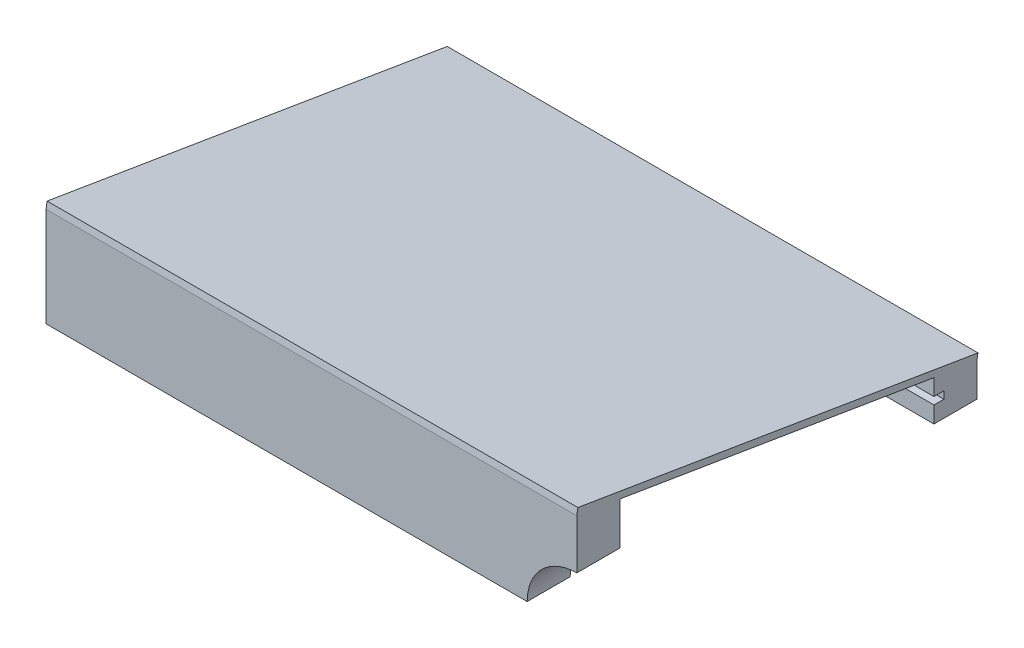
ISO-10303-21;
HEADER;
FILE_DESCRIPTION(('STEP AP214'),'2;1');
FILE_NAME('part.step','',(''),(''),'','','');
FILE_SCHEMA(('AUTOMOTIVE_DESIGN { 1 0 10303 214 1 1 1 1 }'));
ENDSEC;
DATA;
#1=APPLICATION_CONTEXT('core data for automotive mechanical design processes');
#2=APPLICATION_PROTOCOL_DEFINITION('international standard','automotive_design',2000,#1);
#3=PRODUCT_CONTEXT('',#1,'mechanical');
#4=PRODUCT('Part','Part','',(#3));
#5=PRODUCT_RELATED_PRODUCT_CATEGORY('part','',(#4));
#6=PRODUCT_DEFINITION_FORMATION('','',#4);
#7=PRODUCT_DEFINITION_CONTEXT('part definition',#1,'design');
#8=PRODUCT_DEFINITION('design','',#6,#7);
#9=PRODUCT_DEFINITION_SHAPE('','',#8);
#10=(LENGTH_UNIT() NAMED_UNIT(*) SI_UNIT(.MILLI.,.METRE.));
#11=(NAMED_UNIT(*) PLANE_ANGLE_UNIT() SI_UNIT($,.RADIAN.));
#12=(NAMED_UNIT(*) SI_UNIT($,.STERADIAN.) SOLID_ANGLE_UNIT());
#13=UNCERTAINTY_MEASURE_WITH_UNIT(LENGTH_MEASURE(1.E-05),#10,'distance_accuracy_value','');
#14=(GEOMETRIC_REPRESENTATION_CONTEXT(3) GLOBAL_UNCERTAINTY_ASSIGNED_CONTEXT((#13)) GLOBAL_UNIT_ASSIGNED_CONTEXT((#10,
#11,#12)) REPRESENTATION_CONTEXT('',''));
#15=CARTESIAN_POINT('',(0.,0.,0.));
#16=DIRECTION('',(0.,0.,1.));
#17=DIRECTION('',(1.,0.,0.));
#18=AXIS2_PLACEMENT_3D('',#15,#16,#17);
#19=CARTESIAN_POINT('',(0.,0.,0.));
#20=DIRECTION('',(0.,-1.,0.));
#21=DIRECTION('',(0.,0.,-1.));
#22=AXIS2_PLACEMENT_3D('',#19,#20,#21);
#23=PLANE('',#22);
#24=DIRECTION('',(0.,0.,1.));
#25=VECTOR('',#24,1.);
#26=CARTESIAN_POINT('',(128.587823722914,0.,6.68696046181056));
#27=LINE('',#26,#25);
#28=CARTESIAN_POINT('',(128.587823722914,0.,15.1869604618106));
#29=VERTEX_POINT('',#28);
#30=CARTESIAN_POINT('',(128.587823722914,0.,28.1869604618106));
#31=VERTEX_POINT('',#30);
#32=EDGE_CURVE('E184',#29,#31,#27,.T.);
#33=ORIENTED_EDGE('',*,*,#32,.T.);
#34=DIRECTION('',(1.,0.,0.));
#35=VECTOR('',#34,1.);
#36=CARTESIAN_POINT('',(-16.9121762770863,0.,28.1869604618106));
#37=LINE('',#36,#35);
#38=CARTESIAN_POINT('',(-16.9121762770863,0.,28.1869604618106));
#39=VERTEX_POINT('',#38);
#40=EDGE_CURVE('E183',#39,#31,#37,.T.);
#41=ORIENTED_EDGE('',*,*,#40,.F.);
#42=DIRECTION('',(0.,0.,1.));
#43=VECTOR('',#42,1.);
#44=CARTESIAN_POINT('',(-16.9121762770863,0.,28.1869604618106));
#45=LINE('',#44,#43);
#46=CARTESIAN_POINT('',(-16.9121762770863,0.,-92.8130395381894));
#47=VERTEX_POINT('',#46);
#48=EDGE_CURVE('E293',#47,#39,#45,.T.);
#49=ORIENTED_EDGE('',*,*,#48,.F.);
#50=DIRECTION('',(-1.,0.,0.));
#51=VECTOR('',#50,1.);
#52=CARTESIAN_POINT('',(-16.9121762770863,0.,-92.8130395381894));
#53=LINE('',#52,#51);
#54=CARTESIAN_POINT('',(143.587823722914,0.,-92.8130395381894));
#55=VERTEX_POINT('',#54);
#56=EDGE_CURVE('E55',#55,#47,#53,.T.);
#57=ORIENTED_EDGE('',*,*,#56,.F.);
#58=DIRECTION('',(0.,0.,-1.));
#59=VECTOR('',#58,1.);
#60=CARTESIAN_POINT('',(143.587823722914,0.,28.1869604618106));
#61=LINE('',#60,#59);
#62=CARTESIAN_POINT('',(143.587823722914,0.,-79.8130395381894));
#63=VERTEX_POINT('',#62);
#64=EDGE_CURVE('E189',#63,#55,#61,.T.);
#65=ORIENTED_EDGE('',*,*,#64,.F.);
#66=DIRECTION('',(1.,0.,0.));
#67=VECTOR('',#66,1.);
#68=CARTESIAN_POINT('',(-7.91217627708633,0.,-79.8130395381894));
#69=LINE('',#68,#67);
#70=CARTESIAN_POINT('',(-7.91217627708633,0.,-79.8130395381894));
#71=VERTEX_POINT('',#70);
#72=EDGE_CURVE('E302',#71,#63,#69,.T.);
#73=ORIENTED_EDGE('',*,*,#72,.F.);
#74=DIRECTION('',(-0.999999739877011,0.,-0.000721280743499616));
#75=VECTOR('',#74,1.);
#76=CARTESIAN_POINT('',(0.0575634772470563,0.,-79.8072911168786));
#77=LINE('',#76,#75);
#78=CARTESIAN_POINT('',(-11.9108779167771,0.,-79.8159237254314));
#79=VERTEX_POINT('',#78);
#80=EDGE_CURVE('E250',#71,#79,#77,.T.);
#81=ORIENTED_EDGE('',*,*,#80,.T.);
#82=DIRECTION('',(0.,0.,1.));
#83=VECTOR('',#82,1.);
#84=CARTESIAN_POINT('',(-11.9108779167771,0.,0.));
#85=LINE('',#84,#83);
#86=CARTESIAN_POINT('',(-11.9108779167771,0.,15.1869604618106));
#87=VERTEX_POINT('',#86);
#88=EDGE_CURVE('E253',#79,#87,#85,.T.);
#89=ORIENTED_EDGE('',*,*,#88,.T.);
#90=DIRECTION('',(-1.,0.,0.));
#91=VECTOR('',#90,1.);
#92=CARTESIAN_POINT('',(-7.91217627708633,0.,15.1869604618106));
#93=LINE('',#92,#91);
#94=EDGE_CURVE('E300',#29,#87,#93,.T.);
#95=ORIENTED_EDGE('',*,*,#94,.F.);
#96=EDGE_LOOP('',(#33,#41,#49,#57,#65,#73,#81,#89,#95));
#97=FACE_BOUND('',#96,.T.);
#98=ADVANCED_FACE('F33',(#97),#23,.T.);
#99=CARTESIAN_POINT('',(-11.9121762770863,5.,18.1869604618106));
#100=DIRECTION('',(0.,-1.,0.));
#101=DIRECTION('',(0.,0.,-1.));
#102=AXIS2_PLACEMENT_3D('',#99,#100,#101);
#103=PLANE('',#102);
#104=DIRECTION('',(1.,0.,0.));
#105=VECTOR('',#104,1.);
#106=CARTESIAN_POINT('',(-11.9121762770863,5.,18.1869604618106));
#107=LINE('',#106,#105);
#108=CARTESIAN_POINT('',(-11.9121762770863,5.,18.1869604618106));
#109=VERTEX_POINT('',#108);
#110=CARTESIAN_POINT('',(129.445688099183,5.,18.1869604618106));
#111=VERTEX_POINT('',#110);
#112=EDGE_CURVE('E268',#109,#111,#107,.T.);
#113=ORIENTED_EDGE('',*,*,#112,.T.);
#114=DIRECTION('',(0.,0.,1.));
#115=VECTOR('',#114,1.);
#116=CARTESIAN_POINT('',(129.445688099183,5.,6.68696046181056));
#117=LINE('',#116,#115);
#118=CARTESIAN_POINT('',(129.445688099183,5.,15.1869604618106));
#119=VERTEX_POINT('',#118);
#120=EDGE_CURVE('E568',#111,#119,#117,.F.);
#121=ORIENTED_EDGE('',*,*,#120,.T.);
#122=DIRECTION('',(1.,0.,0.));
#123=VECTOR('',#122,1.);
#124=CARTESIAN_POINT('',(-7.91217627708633,5.,15.1869604618106));
#125=LINE('',#124,#123);
#126=CARTESIAN_POINT('',(-11.9108779167771,5.,15.1869604618106));
#127=VERTEX_POINT('',#126);
#128=EDGE_CURVE('E282',#127,#119,#125,.T.);
#129=ORIENTED_EDGE('',*,*,#128,.F.);
#130=DIRECTION('',(0.,0.,1.));
#131=VECTOR('',#130,1.);
#132=CARTESIAN_POINT('',(-11.9108779167771,5.,18.1869604618106));
#133=LINE('',#132,#131);
#134=CARTESIAN_POINT('',(-11.9108779167771,5.,-79.8159237254314));
#135=VERTEX_POINT('',#134);
#136=EDGE_CURVE('E41',#135,#127,#133,.T.);
#137=ORIENTED_EDGE('',*,*,#136,.F.);
#138=DIRECTION('',(-0.999999739877011,0.,-0.000721280743499616));
#139=VECTOR('',#138,1.);
#140=CARTESIAN_POINT('',(-11.8414887016266,5.,-79.8158736763137));
#141=LINE('',#140,#139);
#142=CARTESIAN_POINT('',(-7.91217627708633,5.,-79.8130395381894));
#143=VERTEX_POINT('',#142);
#144=EDGE_CURVE('E315',#143,#135,#141,.T.);
#145=ORIENTED_EDGE('',*,*,#144,.F.);
#146=DIRECTION('',(-1.,0.,0.));
#147=VECTOR('',#146,1.);
#148=CARTESIAN_POINT('',(-7.91217627708633,5.,-79.8130395381894));
#149=LINE('',#148,#147);
#150=CARTESIAN_POINT('',(143.587823722914,5.,-79.8130395381894));
#151=VERTEX_POINT('',#150);
#152=EDGE_CURVE('E272',#151,#143,#149,.T.);
#153=ORIENTED_EDGE('',*,*,#152,.F.);
#154=DIRECTION('',(0.,0.,-1.));
#155=VECTOR('',#154,1.);
#156=CARTESIAN_POINT('',(143.587823722914,5.,18.1869604618106));
#157=LINE('',#156,#155);
#158=CARTESIAN_POINT('',(143.587823722914,5.,-82.8130395381894));
#159=VERTEX_POINT('',#158);
#160=EDGE_CURVE('E216',#151,#159,#157,.T.);
#161=ORIENTED_EDGE('',*,*,#160,.T.);
#162=DIRECTION('',(1.,0.,0.));
#163=VECTOR('',#162,1.);
#164=CARTESIAN_POINT('',(-11.9121762770863,5.,-82.8130395381894));
#165=LINE('',#164,#163);
#166=CARTESIAN_POINT('',(-11.9121762770863,5.,-82.8130395381894));
#167=VERTEX_POINT('',#166);
#168=EDGE_CURVE('E276',#167,#159,#165,.T.);
#169=ORIENTED_EDGE('',*,*,#168,.F.);
#170=DIRECTION('',(0.,0.,-1.));
#171=VECTOR('',#170,1.);
#172=CARTESIAN_POINT('',(-11.9121762770863,5.,18.1869604618106));
#173=LINE('',#172,#171);
#174=EDGE_CURVE('E259',#109,#167,#173,.T.);
#175=ORIENTED_EDGE('',*,*,#174,.F.);
#176=EDGE_LOOP('',(#113,#121,#129,#137,#145,#153,#161,#169,#175));
#177=FACE_BOUND('',#176,.T.);
#178=ADVANCED_FACE('F335',(#177),#103,.F.);
#179=CARTESIAN_POINT('',(-7.91217627708633,30.,15.1869604618106));
#180=DIRECTION('',(0.,0.,1.));
#181=DIRECTION('',(1.,0.,0.));
#182=AXIS2_PLACEMENT_3D('',#179,#180,#181);
#183=PLANE('',#182);
#184=DIRECTION('',(0.,-1.,0.));
#185=VECTOR('',#184,1.);
#186=CARTESIAN_POINT('',(143.587823722914,30.,15.1869604618106));
#187=LINE('',#186,#185);
#188=CARTESIAN_POINT('',(143.587823722914,27.8512396694215,15.1869604618106));
#189=VERTEX_POINT('',#188);
#190=CARTESIAN_POINT('',(143.587823722914,15.,15.1869604618106));
#191=VERTEX_POINT('',#190);
#192=EDGE_CURVE('E202',#189,#191,#187,.T.);
#193=ORIENTED_EDGE('',*,*,#192,.T.);
#194=CARTESIAN_POINT('',(143.587823722914,0.,15.1869604618106));
#195=DIRECTION('',(0.,0.,1.));
#196=DIRECTION('',(1.,0.,0.));
#197=AXIS2_PLACEMENT_3D('',#194,#195,#196);
#198=CIRCLE('',#197,15.);
#199=CARTESIAN_POINT('',(130.428796403237,7.2,15.1869604618106));
#200=VERTEX_POINT('',#199);
#201=EDGE_CURVE('E48',#191,#200,#198,.T.);
#202=ORIENTED_EDGE('',*,*,#201,.T.);
#203=DIRECTION('',(-1.,0.,0.));
#204=VECTOR('',#203,1.);
#205=CARTESIAN_POINT('',(-7.91217627708633,7.2,15.1869604618106));
#206=LINE('',#205,#204);
#207=CARTESIAN_POINT('',(-7.91217627708633,7.2,15.1869604618106));
#208=VERTEX_POINT('',#207);
#209=EDGE_CURVE('E291',#200,#208,#206,.T.);
#210=ORIENTED_EDGE('',*,*,#209,.T.);
#211=DIRECTION('',(0.,-1.,0.));
#212=VECTOR('',#211,1.);
#213=CARTESIAN_POINT('',(-7.91217627708633,30.,15.1869604618106));
#214=LINE('',#213,#212);
#215=CARTESIAN_POINT('',(-7.91217627708633,27.8512396694215,15.1869604618106));
#216=VERTEX_POINT('',#215);
#217=EDGE_CURVE('E310',#216,#208,#214,.T.);
#218=ORIENTED_EDGE('',*,*,#217,.F.);
#219=DIRECTION('',(1.,0.,0.));
#220=VECTOR('',#219,1.);
#221=CARTESIAN_POINT('',(-7.91217627708633,27.8512396694215,15.1869604618106));
#222=LINE('',#221,#220);
#223=EDGE_CURVE('E241',#216,#189,#222,.T.);
#224=ORIENTED_EDGE('',*,*,#223,.T.);
#225=EDGE_LOOP('',(#193,#202,#210,#218,#224));
#226=FACE_BOUND('',#225,.T.);
#227=ADVANCED_FACE('F372',(#226),#183,.F.);
#228=CARTESIAN_POINT('',(-7.91217627708633,30.,15.1869604618106));
#229=DIRECTION('',(-1.,0.,0.));
#230=DIRECTION('',(0.,0.,1.));
#231=AXIS2_PLACEMENT_3D('',#228,#229,#230);
#232=PLANE('',#231);
#233=DIRECTION('',(0.,-1.,0.));
#234=VECTOR('',#233,1.);
#235=CARTESIAN_POINT('',(-7.91217627708633,30.,-79.8130395381894));
#236=LINE('',#235,#234);
#237=CARTESIAN_POINT('',(-7.91217627708633,12.1487603305785,-79.8130395381894));
#238=VERTEX_POINT('',#237);
#239=CARTESIAN_POINT('',(-7.91217627708633,7.2,-79.8130395381894));
#240=VERTEX_POINT('',#239);
#241=EDGE_CURVE('E308',#238,#240,#236,.T.);
#242=ORIENTED_EDGE('',*,*,#241,.F.);
#243=DIRECTION('',(0.,0.163076596924055,0.986613411390535));
#244=VECTOR('',#243,1.);
#245=CARTESIAN_POINT('',(-7.91217627708633,27.9083837510804,15.5326821558469));
#246=LINE('',#245,#244);
#247=EDGE_CURVE('E238',#238,#216,#246,.T.);
#248=ORIENTED_EDGE('',*,*,#247,.T.);
#249=ORIENTED_EDGE('',*,*,#217,.T.);
#250=DIRECTION('',(0.,0.,-1.));
#251=VECTOR('',#250,1.);
#252=CARTESIAN_POINT('',(-7.91217627708633,7.2,15.1869604618106));
#253=LINE('',#252,#251);
#254=EDGE_CURVE('E288',#208,#240,#253,.T.);
#255=ORIENTED_EDGE('',*,*,#254,.T.);
#256=EDGE_LOOP('',(#242,#248,#249,#255));
#257=FACE_BOUND('',#256,.T.);
#258=ADVANCED_FACE('F383',(#257),#232,.F.);
#259=CARTESIAN_POINT('',(-7.91217627708633,30.,-79.8130395381894));
#260=DIRECTION('',(0.,0.,-1.));
#261=DIRECTION('',(-1.,0.,0.));
#262=AXIS2_PLACEMENT_3D('',#259,#260,#261);
#263=PLANE('',#262);
#264=DIRECTION('',(1.,0.,0.));
#265=VECTOR('',#264,1.);
#266=CARTESIAN_POINT('',(-7.91217627708633,7.2,-79.8130395381894));
#267=LINE('',#266,#265);
#268=CARTESIAN_POINT('',(143.587823722914,7.2,-79.8130395381894));
#269=VERTEX_POINT('',#268);
#270=EDGE_CURVE('E285',#240,#269,#267,.T.);
#271=ORIENTED_EDGE('',*,*,#270,.T.);
#272=DIRECTION('',(0.,1.,0.));
#273=VECTOR('',#272,1.);
#274=CARTESIAN_POINT('',(143.587823722914,30.,-79.8130395381894));
#275=LINE('',#274,#273);
#276=CARTESIAN_POINT('',(143.587823722914,12.1487603305785,-79.8130395381895));
#277=VERTEX_POINT('',#276);
#278=EDGE_CURVE('E207',#269,#277,#275,.T.);
#279=ORIENTED_EDGE('',*,*,#278,.T.);
#280=DIRECTION('',(-1.,0.,0.));
#281=VECTOR('',#280,1.);
#282=CARTESIAN_POINT('',(-7.91217627708633,12.1487603305785,-79.8130395381894));
#283=LINE('',#282,#281);
#284=EDGE_CURVE('E236',#277,#238,#283,.T.);
#285=ORIENTED_EDGE('',*,*,#284,.T.);
#286=ORIENTED_EDGE('',*,*,#241,.T.);
#287=EDGE_LOOP('',(#271,#279,#285,#286));
#288=FACE_BOUND('',#287,.T.);
#289=ADVANCED_FACE('F382',(#288),#263,.F.);
#290=CARTESIAN_POINT('',(-16.9121762770863,30.,28.1869604618106));
#291=DIRECTION('',(1.,0.,0.));
#292=DIRECTION('',(0.,0.,-1.));
#293=AXIS2_PLACEMENT_3D('',#290,#291,#292);
#294=PLANE('',#293);
#295=DIRECTION('',(0.,-1.,0.));
#296=VECTOR('',#295,1.);
#297=CARTESIAN_POINT('',(-16.9121762770863,30.,28.1869604618106));
#298=LINE('',#297,#296);
#299=CARTESIAN_POINT('',(-16.9121762770863,30.,28.1869604618106));
#300=VERTEX_POINT('',#299);
#301=EDGE_CURVE('E313',#300,#39,#298,.T.);
#302=ORIENTED_EDGE('',*,*,#301,.F.);
#303=DIRECTION('',(0.,-0.986613411390535,0.163076596924055));
#304=VECTOR('',#303,1.);
#305=CARTESIAN_POINT('',(-16.9121762770863,31.9732268227811,27.8608072679624));
#306=LINE('',#305,#304);
#307=CARTESIAN_POINT('',(-16.9121762770863,31.9732268227811,27.8608072679624));
#308=VERTEX_POINT('',#307);
#309=EDGE_CURVE('E229',#308,#300,#306,.T.);
#310=ORIENTED_EDGE('',*,*,#309,.F.);
#311=DIRECTION('',(0.,0.163076596924055,0.986613411390535));
#312=VECTOR('',#311,1.);
#313=CARTESIAN_POINT('',(-16.9121762770863,11.9732268227811,-93.1391927320376));
#314=LINE('',#313,#312);
#315=CARTESIAN_POINT('',(-16.9121762770863,11.9732268227811,-93.1391927320376));
#316=VERTEX_POINT('',#315);
#317=EDGE_CURVE('E224',#316,#308,#314,.T.);
#318=ORIENTED_EDGE('',*,*,#317,.F.);
#319=DIRECTION('',(0.,-0.986613411390535,0.163076596924055));
#320=VECTOR('',#319,1.);
#321=CARTESIAN_POINT('',(-16.9121762770863,11.9732268227811,-93.1391927320376));
#322=LINE('',#321,#320);
#323=CARTESIAN_POINT('',(-16.9121762770863,10.,-92.8130395381894));
#324=VERTEX_POINT('',#323);
#325=EDGE_CURVE('E231',#316,#324,#322,.T.);
#326=ORIENTED_EDGE('',*,*,#325,.T.);
#327=DIRECTION('',(0.,-1.,0.));
#328=VECTOR('',#327,1.);
#329=CARTESIAN_POINT('',(-16.9121762770863,30.,-92.8130395381894));
#330=LINE('',#329,#328);
#331=EDGE_CURVE('E296',#324,#47,#330,.T.);
#332=ORIENTED_EDGE('',*,*,#331,.T.);
#333=ORIENTED_EDGE('',*,*,#48,.T.);
#334=EDGE_LOOP('',(#302,#310,#318,#326,#332,#333));
#335=FACE_BOUND('',#334,.T.);
#336=ADVANCED_FACE('F35',(#335),#294,.F.);
#337=CARTESIAN_POINT('',(-16.9121762770863,30.,28.1869604618106));
#338=DIRECTION('',(0.,0.,-1.));
#339=DIRECTION('',(-1.,0.,0.));
#340=AXIS2_PLACEMENT_3D('',#337,#338,#339);
#341=PLANE('',#340);
#342=ORIENTED_EDGE('',*,*,#40,.T.);
#343=CARTESIAN_POINT('',(143.587823722914,0.,28.1869604618106));
#344=DIRECTION('',(0.,0.,1.));
#345=DIRECTION('',(1.,0.,0.));
#346=AXIS2_PLACEMENT_3D('',#343,#344,#345);
#347=CIRCLE('',#346,15.);
#348=CARTESIAN_POINT('',(143.587823722914,15.,28.1869604618106));
#349=VERTEX_POINT('',#348);
#350=EDGE_CURVE('E170',#349,#31,#347,.T.);
#351=ORIENTED_EDGE('',*,*,#350,.F.);
#352=DIRECTION('',(0.,-1.,0.));
#353=VECTOR('',#352,1.);
#354=CARTESIAN_POINT('',(143.587823722914,30.,28.1869604618106));
#355=LINE('',#354,#353);
#356=CARTESIAN_POINT('',(143.587823722914,30.,28.1869604618106));
#357=VERTEX_POINT('',#356);
#358=EDGE_CURVE('E180',#357,#349,#355,.T.);
#359=ORIENTED_EDGE('',*,*,#358,.F.);
#360=DIRECTION('',(1.,0.,0.));
#361=VECTOR('',#360,1.);
#362=CARTESIAN_POINT('',(-16.9121762770863,30.,28.1869604618106));
#363=LINE('',#362,#361);
#364=EDGE_CURVE('E294',#300,#357,#363,.T.);
#365=ORIENTED_EDGE('',*,*,#364,.F.);
#366=ORIENTED_EDGE('',*,*,#301,.T.);
#367=EDGE_LOOP('',(#342,#351,#359,#365,#366));
#368=FACE_BOUND('',#367,.T.);
#369=ADVANCED_FACE('F178',(#368),#341,.F.);
#370=ORIENTED_EDGE('',*,*,#128,.T.);
#371=CARTESIAN_POINT('',(143.587823722914,0.,15.1869604618106));
#372=DIRECTION('',(0.,0.,1.));
#373=DIRECTION('',(1.,0.,0.));
#374=AXIS2_PLACEMENT_3D('',#371,#372,#373);
#375=CIRCLE('',#374,15.);
#376=EDGE_CURVE('E193',#119,#29,#375,.T.);
#377=ORIENTED_EDGE('',*,*,#376,.T.);
#378=ORIENTED_EDGE('',*,*,#94,.T.);
#379=DIRECTION('',(0.,1.,0.));
#380=VECTOR('',#379,1.);
#381=CARTESIAN_POINT('',(-11.9108779167771,-100.8,15.1869604618106));
#382=LINE('',#381,#380);
#383=EDGE_CURVE('E247',#87,#127,#382,.T.);
#384=ORIENTED_EDGE('',*,*,#383,.T.);
#385=EDGE_LOOP('',(#370,#377,#378,#384));
#386=FACE_BOUND('',#385,.T.);
#387=ADVANCED_FACE('F325',(#386),#183,.F.);
#388=ORIENTED_EDGE('',*,*,#72,.T.);
#389=DIRECTION('',(0.,1.,0.));
#390=VECTOR('',#389,1.);
#391=CARTESIAN_POINT('',(143.587823722914,30.,-79.8130395381894));
#392=LINE('',#391,#390);
#393=EDGE_CURVE('E219',#63,#151,#392,.T.);
#394=ORIENTED_EDGE('',*,*,#393,.T.);
#395=ORIENTED_EDGE('',*,*,#152,.T.);
#396=EDGE_CURVE('E307',#143,#71,#236,.T.);
#397=ORIENTED_EDGE('',*,*,#396,.T.);
#398=EDGE_LOOP('',(#388,#394,#395,#397));
#399=FACE_BOUND('',#398,.T.);
#400=ADVANCED_FACE('F337',(#399),#263,.F.);
#401=CARTESIAN_POINT('',(-16.9121762770863,30.,-92.8130395381894));
#402=DIRECTION('',(0.,0.,1.));
#403=DIRECTION('',(1.,0.,0.));
#404=AXIS2_PLACEMENT_3D('',#401,#402,#403);
#405=PLANE('',#404);
#406=DIRECTION('',(-1.,0.,0.));
#407=VECTOR('',#406,1.);
#408=CARTESIAN_POINT('',(185.087823722914,10.,-92.8130395381894));
#409=LINE('',#408,#407);
#410=CARTESIAN_POINT('',(143.587823722914,10.,-92.8130395381894));
#411=VERTEX_POINT('',#410);
#412=EDGE_CURVE('E234',#411,#324,#409,.T.);
#413=ORIENTED_EDGE('',*,*,#412,.F.);
#414=DIRECTION('',(0.,1.,0.));
#415=VECTOR('',#414,1.);
#416=CARTESIAN_POINT('',(143.587823722914,0.,-92.8130395381894));
#417=LINE('',#416,#415);
#418=EDGE_CURVE('E191',#55,#411,#417,.T.);
#419=ORIENTED_EDGE('',*,*,#418,.F.);
#420=ORIENTED_EDGE('',*,*,#56,.T.);
#421=ORIENTED_EDGE('',*,*,#331,.F.);
#422=EDGE_LOOP('',(#413,#419,#420,#421));
#423=FACE_BOUND('',#422,.T.);
#424=ADVANCED_FACE('F346',(#423),#405,.F.);
#425=CARTESIAN_POINT('',(-11.9121762770863,7.2,18.1869604618106));
#426=DIRECTION('',(0.,1.,0.));
#427=DIRECTION('',(0.,0.,1.));
#428=AXIS2_PLACEMENT_3D('',#425,#426,#427);
#429=PLANE('',#428);
#430=ORIENTED_EDGE('',*,*,#209,.F.);
#431=DIRECTION('',(0.,0.,1.));
#432=VECTOR('',#431,1.);
#433=CARTESIAN_POINT('',(130.428796403237,7.2,6.68696046181056));
#434=LINE('',#433,#432);
#435=CARTESIAN_POINT('',(130.428796403237,7.2,18.1869604618106));
#436=VERTEX_POINT('',#435);
#437=EDGE_CURVE('E409',#200,#436,#434,.T.);
#438=ORIENTED_EDGE('',*,*,#437,.T.);
#439=DIRECTION('',(1.,0.,0.));
#440=VECTOR('',#439,1.);
#441=CARTESIAN_POINT('',(-11.9121762770863,7.2,18.1869604618106));
#442=LINE('',#441,#440);
#443=CARTESIAN_POINT('',(-11.9121762770863,7.2,18.1869604618106));
#444=VERTEX_POINT('',#443);
#445=EDGE_CURVE('E269',#444,#436,#442,.T.);
#446=ORIENTED_EDGE('',*,*,#445,.F.);
#447=DIRECTION('',(0.,0.,1.));
#448=VECTOR('',#447,1.);
#449=CARTESIAN_POINT('',(-11.9121762770863,7.2,18.1869604618106));
#450=LINE('',#449,#448);
#451=CARTESIAN_POINT('',(-11.9121762770863,7.2,-82.8130395381894));
#452=VERTEX_POINT('',#451);
#453=EDGE_CURVE('E265',#452,#444,#450,.T.);
#454=ORIENTED_EDGE('',*,*,#453,.F.);
#455=DIRECTION('',(1.,0.,0.));
#456=VECTOR('',#455,1.);
#457=CARTESIAN_POINT('',(-11.9121762770863,7.2,-82.8130395381894));
#458=LINE('',#457,#456);
#459=CARTESIAN_POINT('',(143.587823722914,7.2,-82.8130395381894));
#460=VERTEX_POINT('',#459);
#461=EDGE_CURVE('E273',#452,#460,#458,.T.);
#462=ORIENTED_EDGE('',*,*,#461,.T.);
#463=DIRECTION('',(0.,0.,1.));
#464=VECTOR('',#463,1.);
#465=CARTESIAN_POINT('',(143.587823722914,7.2,18.1869604618106));
#466=LINE('',#465,#464);
#467=EDGE_CURVE('E210',#460,#269,#466,.T.);
#468=ORIENTED_EDGE('',*,*,#467,.T.);
#469=ORIENTED_EDGE('',*,*,#270,.F.);
#470=ORIENTED_EDGE('',*,*,#254,.F.);
#471=EDGE_LOOP('',(#430,#438,#446,#454,#462,#468,#469,#470));
#472=FACE_BOUND('',#471,.T.);
#473=ADVANCED_FACE('F379',(#472),#429,.F.);
#474=CARTESIAN_POINT('',(-11.9121762770863,7.2,18.1869604618106));
#475=DIRECTION('',(0.,0.,1.));
#476=DIRECTION('',(1.,0.,0.));
#477=AXIS2_PLACEMENT_3D('',#474,#475,#476);
#478=PLANE('',#477);
#479=ORIENTED_EDGE('',*,*,#445,.T.);
#480=CARTESIAN_POINT('',(143.587823722914,0.,18.1869604618106));
#481=DIRECTION('',(0.,0.,1.));
#482=DIRECTION('',(1.,0.,0.));
#483=AXIS2_PLACEMENT_3D('',#480,#481,#482);
#484=CIRCLE('',#483,15.);
#485=EDGE_CURVE('E412',#436,#111,#484,.T.);
#486=ORIENTED_EDGE('',*,*,#485,.T.);
#487=ORIENTED_EDGE('',*,*,#112,.F.);
#488=DIRECTION('',(0.,-1.,0.));
#489=VECTOR('',#488,1.);
#490=CARTESIAN_POINT('',(-11.9121762770863,7.2,18.1869604618106));
#491=LINE('',#490,#489);
#492=EDGE_CURVE('E256',#444,#109,#491,.T.);
#493=ORIENTED_EDGE('',*,*,#492,.F.);
#494=EDGE_LOOP('',(#479,#486,#487,#493));
#495=FACE_BOUND('',#494,.T.);
#496=ADVANCED_FACE('F376',(#495),#478,.F.);
#497=CARTESIAN_POINT('',(-11.9121762770863,7.2,-82.8130395381894));
#498=DIRECTION('',(0.,0.,-1.));
#499=DIRECTION('',(-1.,0.,0.));
#500=AXIS2_PLACEMENT_3D('',#497,#498,#499);
#501=PLANE('',#500);
#502=ORIENTED_EDGE('',*,*,#168,.T.);
#503=DIRECTION('',(0.,1.,0.));
#504=VECTOR('',#503,1.);
#505=CARTESIAN_POINT('',(143.587823722914,7.2,-82.8130395381894));
#506=LINE('',#505,#504);
#507=EDGE_CURVE('E213',#159,#460,#506,.T.);
#508=ORIENTED_EDGE('',*,*,#507,.T.);
#509=ORIENTED_EDGE('',*,*,#461,.F.);
#510=DIRECTION('',(0.,1.,0.));
#511=VECTOR('',#510,1.);
#512=CARTESIAN_POINT('',(-11.9121762770863,7.2,-82.8130395381894));
#513=LINE('',#512,#511);
#514=EDGE_CURVE('E262',#167,#452,#513,.T.);
#515=ORIENTED_EDGE('',*,*,#514,.F.);
#516=EDGE_LOOP('',(#502,#508,#509,#515));
#517=FACE_BOUND('',#516,.T.);
#518=ADVANCED_FACE('F421',(#517),#501,.F.);
#519=CARTESIAN_POINT('',(-11.9121762770863,0.,0.));
#520=DIRECTION('',(1.,0.,0.));
#521=DIRECTION('',(0.,0.,-1.));
#522=AXIS2_PLACEMENT_3D('',#519,#520,#521);
#523=PLANE('',#522);
#524=ORIENTED_EDGE('',*,*,#492,.T.);
#525=ORIENTED_EDGE('',*,*,#174,.T.);
#526=ORIENTED_EDGE('',*,*,#514,.T.);
#527=ORIENTED_EDGE('',*,*,#453,.T.);
#528=EDGE_LOOP('',(#524,#525,#526,#527));
#529=FACE_BOUND('',#528,.T.);
#530=ADVANCED_FACE('F418',(#529),#523,.T.);
#531=CARTESIAN_POINT('',(-11.9108779167771,-100.8,15.1869604618106));
#532=DIRECTION('',(1.,0.,0.));
#533=DIRECTION('',(0.,0.,-1.));
#534=AXIS2_PLACEMENT_3D('',#531,#532,#533);
#535=PLANE('',#534);
#536=DIRECTION('',(0.,1.,0.));
#537=VECTOR('',#536,1.);
#538=CARTESIAN_POINT('',(-11.9108779167771,-100.8,-79.8159237254314));
#539=LINE('',#538,#537);
#540=EDGE_CURVE('E244',#79,#135,#539,.T.);
#541=ORIENTED_EDGE('',*,*,#540,.T.);
#542=ORIENTED_EDGE('',*,*,#136,.T.);
#543=ORIENTED_EDGE('',*,*,#383,.F.);
#544=ORIENTED_EDGE('',*,*,#88,.F.);
#545=EDGE_LOOP('',(#541,#542,#543,#544));
#546=FACE_BOUND('',#545,.T.);
#547=ADVANCED_FACE('F320',(#546),#535,.T.);
#548=CARTESIAN_POINT('',(-11.9108779167771,-100.8,-79.8159237254314));
#549=DIRECTION('',(-0.000721280743499616,0.,0.999999739877011));
#550=DIRECTION('',(0.999999739877011,0.,0.000721280743499616));
#551=AXIS2_PLACEMENT_3D('',#548,#549,#550);
#552=PLANE('',#551);
#553=ORIENTED_EDGE('',*,*,#396,.F.);
#554=ORIENTED_EDGE('',*,*,#144,.T.);
#555=ORIENTED_EDGE('',*,*,#540,.F.);
#556=ORIENTED_EDGE('',*,*,#80,.F.);
#557=EDGE_LOOP('',(#553,#554,#555,#556));
#558=FACE_BOUND('',#557,.T.);
#559=ADVANCED_FACE('F332',(#558),#552,.T.);
#560=CARTESIAN_POINT('',(0.,24.6670803591795,-4.07720336515363));
#561=DIRECTION('',(0.,0.986613411390535,-0.163076596924055));
#562=DIRECTION('',(0.,0.163076596924055,0.986613411390535));
#563=AXIS2_PLACEMENT_3D('',#560,#561,#562);
#564=PLANE('',#563);
#565=ORIENTED_EDGE('',*,*,#284,.F.);
#566=DIRECTION('',(0.,0.163076596924055,0.986613411390535));
#567=VECTOR('',#566,1.);
#568=CARTESIAN_POINT('',(143.587823722914,24.6670803591795,-4.07720336515363));
#569=LINE('',#568,#567);
#570=EDGE_CURVE('E204',#277,#189,#569,.T.);
#571=ORIENTED_EDGE('',*,*,#570,.T.);
#572=ORIENTED_EDGE('',*,*,#223,.F.);
#573=ORIENTED_EDGE('',*,*,#247,.F.);
#574=EDGE_LOOP('',(#565,#571,#572,#573));
#575=FACE_BOUND('',#574,.T.);
#576=ADVANCED_FACE('F364',(#575),#564,.F.);
#577=CARTESIAN_POINT('',(148.087823722914,11.9732268227811,-93.1391927320376));
#578=DIRECTION('',(0.,0.163076596924055,0.986613411390535));
#579=DIRECTION('',(0.,-0.986613411390535,0.163076596924055));
#580=AXIS2_PLACEMENT_3D('',#577,#578,#579);
#581=PLANE('',#580);
#582=DIRECTION('',(-1.,0.,0.));
#583=VECTOR('',#582,1.);
#584=CARTESIAN_POINT('',(148.087823722914,11.9732268227811,-93.1391927320376));
#585=LINE('',#584,#583);
#586=CARTESIAN_POINT('',(143.587823722914,11.9732268227811,-93.1391927320376));
#587=VERTEX_POINT('',#586);
#588=EDGE_CURVE('E222',#587,#316,#585,.T.);
#589=ORIENTED_EDGE('',*,*,#588,.F.);
#590=DIRECTION('',(0.,0.986613411390535,-0.163076596924057));
#591=VECTOR('',#590,1.);
#592=CARTESIAN_POINT('',(143.587823722914,10.,-92.8130395381894));
#593=LINE('',#592,#591);
#594=EDGE_CURVE('E198',#411,#587,#593,.T.);
#595=ORIENTED_EDGE('',*,*,#594,.F.);
#596=ORIENTED_EDGE('',*,*,#412,.T.);
#597=ORIENTED_EDGE('',*,*,#325,.F.);
#598=EDGE_LOOP('',(#589,#595,#596,#597));
#599=FACE_BOUND('',#598,.T.);
#600=ADVANCED_FACE('F350',(#599),#581,.F.);
#601=CARTESIAN_POINT('',(-16.9121762770863,31.9732268227811,27.8608072679624));
#602=DIRECTION('',(0.,-0.163076596924055,-0.986613411390535));
#603=DIRECTION('',(0.,0.986613411390535,-0.163076596924055));
#604=AXIS2_PLACEMENT_3D('',#601,#602,#603);
#605=PLANE('',#604);
#606=ORIENTED_EDGE('',*,*,#364,.T.);
#607=DIRECTION('',(0.,-0.986613411390535,0.163076596924055));
#608=VECTOR('',#607,1.);
#609=CARTESIAN_POINT('',(143.587823722914,31.9732268227811,27.8608072679624));
#610=LINE('',#609,#608);
#611=CARTESIAN_POINT('',(143.587823722914,31.9732268227811,27.8608072679624));
#612=VERTEX_POINT('',#611);
#613=EDGE_CURVE('E188',#612,#357,#610,.T.);
#614=ORIENTED_EDGE('',*,*,#613,.F.);
#615=DIRECTION('',(1.,0.,0.));
#616=VECTOR('',#615,1.);
#617=CARTESIAN_POINT('',(-16.9121762770863,31.9732268227811,27.8608072679624));
#618=LINE('',#617,#616);
#619=EDGE_CURVE('E226',#308,#612,#618,.T.);
#620=ORIENTED_EDGE('',*,*,#619,.F.);
#621=ORIENTED_EDGE('',*,*,#309,.T.);
#622=EDGE_LOOP('',(#606,#614,#620,#621));
#623=FACE_BOUND('',#622,.T.);
#624=ADVANCED_FACE('F356',(#623),#605,.F.);
#625=CARTESIAN_POINT('',(0.,26.6403071819605,-4.40335655900174));
#626=DIRECTION('',(0.,0.986613411390535,-0.163076596924055));
#627=DIRECTION('',(0.,0.163076596924055,0.986613411390535));
#628=AXIS2_PLACEMENT_3D('',#625,#626,#627);
#629=PLANE('',#628);
#630=DIRECTION('',(0.,0.163076596924055,0.986613411390535));
#631=VECTOR('',#630,1.);
#632=CARTESIAN_POINT('',(143.587823722914,11.9732268227811,-93.1391927320376));
#633=LINE('',#632,#631);
#634=EDGE_CURVE('E200',#587,#612,#633,.T.);
#635=ORIENTED_EDGE('',*,*,#634,.F.);
#636=ORIENTED_EDGE('',*,*,#588,.T.);
#637=ORIENTED_EDGE('',*,*,#317,.T.);
#638=ORIENTED_EDGE('',*,*,#619,.T.);
#639=EDGE_LOOP('',(#635,#636,#637,#638));
#640=FACE_BOUND('',#639,.T.);
#641=ADVANCED_FACE('F353',(#640),#629,.T.);
#642=CARTESIAN_POINT('',(143.587823722914,0.,0.));
#643=DIRECTION('',(-1.,0.,0.));
#644=DIRECTION('',(0.,0.,1.));
#645=AXIS2_PLACEMENT_3D('',#642,#643,#644);
#646=PLANE('',#645);
#647=ORIENTED_EDGE('',*,*,#358,.T.);
#648=DIRECTION('',(0.,0.,1.));
#649=VECTOR('',#648,1.);
#650=CARTESIAN_POINT('',(143.587823722914,15.,6.68696046181056));
#651=LINE('',#650,#649);
#652=EDGE_CURVE('E11',#349,#191,#651,.F.);
#653=ORIENTED_EDGE('',*,*,#652,.T.);
#654=ORIENTED_EDGE('',*,*,#192,.F.);
#655=ORIENTED_EDGE('',*,*,#570,.F.);
#656=ORIENTED_EDGE('',*,*,#278,.F.);
#657=ORIENTED_EDGE('',*,*,#467,.F.);
#658=ORIENTED_EDGE('',*,*,#507,.F.);
#659=ORIENTED_EDGE('',*,*,#160,.F.);
#660=ORIENTED_EDGE('',*,*,#393,.F.);
#661=ORIENTED_EDGE('',*,*,#64,.T.);
#662=ORIENTED_EDGE('',*,*,#418,.T.);
#663=ORIENTED_EDGE('',*,*,#594,.T.);
#664=ORIENTED_EDGE('',*,*,#634,.T.);
#665=ORIENTED_EDGE('',*,*,#613,.T.);
#666=EDGE_LOOP('',(#647,#653,#654,#655,#656,#657,#658,#659,#660,#661,#662,#663,#664,#665));
#667=FACE_BOUND('',#666,.T.);
#668=ADVANCED_FACE('F186',(#667),#646,.F.);
#669=CARTESIAN_POINT('',(143.587823722914,0.,6.68696046181056));
#670=DIRECTION('',(0.,0.,1.));
#671=DIRECTION('',(1.,0.,0.));
#672=AXIS2_PLACEMENT_3D('',#669,#670,#671);
#673=CYLINDRICAL_SURFACE('',#672,15.);
#674=ORIENTED_EDGE('',*,*,#120,.F.);
#675=ORIENTED_EDGE('',*,*,#485,.F.);
#676=ORIENTED_EDGE('',*,*,#437,.F.);
#677=ORIENTED_EDGE('',*,*,#201,.F.);
#678=ORIENTED_EDGE('',*,*,#652,.F.);
#679=ORIENTED_EDGE('',*,*,#350,.T.);
#680=ORIENTED_EDGE('',*,*,#32,.F.);
#681=ORIENTED_EDGE('',*,*,#376,.F.);
#682=EDGE_LOOP('',(#674,#675,#676,#677,#678,#679,#680,#681));
#683=FACE_BOUND('',#682,.T.);
#684=ADVANCED_FACE('F169',(#683),#673,.F.);
#685=CLOSED_SHELL('',(#98,#178,#227,#258,#289,#336,#369,#387,#400,#424,#473,#496,#518,#530,#547,
#559,#576,#600,#624,#641,#668,#684));
#686=MANIFOLD_SOLID_BREP('B2',#685);
#687=ADVANCED_BREP_SHAPE_REPRESENTATION('',(#18,#686),#14);
#688=SHAPE_DEFINITION_REPRESENTATION(#9,#687);
ENDSEC;
END-ISO-10303-21;
